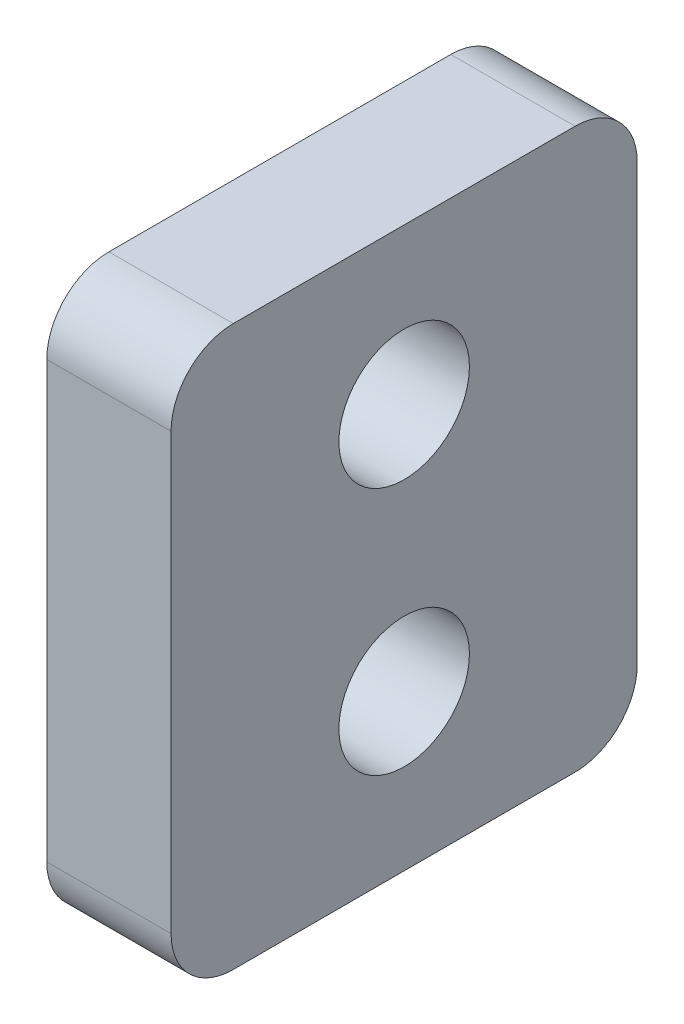
ISO-10303-21;
HEADER;
FILE_DESCRIPTION(('STEP AP214'),'2;1');
FILE_NAME('part.step','',(''),(''),'','','');
FILE_SCHEMA(('AUTOMOTIVE_DESIGN { 1 0 10303 214 1 1 1 1 }'));
ENDSEC;
DATA;
#1=APPLICATION_CONTEXT('core data for automotive mechanical design processes');
#2=APPLICATION_PROTOCOL_DEFINITION('international standard','automotive_design',2000,#1);
#3=PRODUCT_CONTEXT('',#1,'mechanical');
#4=PRODUCT('Part','Part','',(#3));
#5=PRODUCT_RELATED_PRODUCT_CATEGORY('part','',(#4));
#6=PRODUCT_DEFINITION_FORMATION('','',#4);
#7=PRODUCT_DEFINITION_CONTEXT('part definition',#1,'design');
#8=PRODUCT_DEFINITION('design','',#6,#7);
#9=PRODUCT_DEFINITION_SHAPE('','',#8);
#10=(LENGTH_UNIT() NAMED_UNIT(*) SI_UNIT(.MILLI.,.METRE.));
#11=(NAMED_UNIT(*) PLANE_ANGLE_UNIT() SI_UNIT($,.RADIAN.));
#12=(NAMED_UNIT(*) SI_UNIT($,.STERADIAN.) SOLID_ANGLE_UNIT());
#13=UNCERTAINTY_MEASURE_WITH_UNIT(LENGTH_MEASURE(1.E-05),#10,'distance_accuracy_value','');
#14=(GEOMETRIC_REPRESENTATION_CONTEXT(3) GLOBAL_UNCERTAINTY_ASSIGNED_CONTEXT((#13)) GLOBAL_UNIT_ASSIGNED_CONTEXT((#10,
#11,#12)) REPRESENTATION_CONTEXT('',''));
#15=CARTESIAN_POINT('',(0.,0.,0.));
#16=DIRECTION('',(0.,0.,1.));
#17=DIRECTION('',(1.,0.,0.));
#18=AXIS2_PLACEMENT_3D('',#15,#16,#17);
#19=CARTESIAN_POINT('',(4.,0.,0.));
#20=DIRECTION('',(-1.,0.,0.));
#21=DIRECTION('',(0.,0.,1.));
#22=AXIS2_PLACEMENT_3D('',#19,#20,#21);
#23=PLANE('',#22);
#24=DIRECTION('',(0.,0.,-1.));
#25=VECTOR('',#24,1.);
#26=CARTESIAN_POINT('',(4.,-9.,7.5));
#27=LINE('',#26,#25);
#28=CARTESIAN_POINT('',(4.,-9.,5.5));
#29=VERTEX_POINT('',#28);
#30=CARTESIAN_POINT('',(4.,-9.,-5.5));
#31=VERTEX_POINT('',#30);
#32=EDGE_CURVE('E137',#29,#31,#27,.T.);
#33=ORIENTED_EDGE('',*,*,#32,.T.);
#34=CARTESIAN_POINT('',(4.,-7.,-5.5));
#35=DIRECTION('',(-1.,0.,0.));
#36=DIRECTION('',(0.,0.,1.));
#37=AXIS2_PLACEMENT_3D('',#34,#35,#36);
#38=CIRCLE('',#37,2.);
#39=CARTESIAN_POINT('',(4.,-7.,-7.5));
#40=VERTEX_POINT('',#39);
#41=EDGE_CURVE('E155',#31,#40,#38,.F.);
#42=ORIENTED_EDGE('',*,*,#41,.T.);
#43=DIRECTION('',(0.,1.,0.));
#44=VECTOR('',#43,1.);
#45=CARTESIAN_POINT('',(4.,-9.,-7.5));
#46=LINE('',#45,#44);
#47=CARTESIAN_POINT('',(4.,7.,-7.5));
#48=VERTEX_POINT('',#47);
#49=EDGE_CURVE('E119',#40,#48,#46,.T.);
#50=ORIENTED_EDGE('',*,*,#49,.T.);
#51=CARTESIAN_POINT('',(4.,7.,-5.5));
#52=DIRECTION('',(-1.,0.,0.));
#53=DIRECTION('',(0.,0.,1.));
#54=AXIS2_PLACEMENT_3D('',#51,#52,#53);
#55=CIRCLE('',#54,2.);
#56=CARTESIAN_POINT('',(4.,9.,-5.5));
#57=VERTEX_POINT('',#56);
#58=EDGE_CURVE('E151',#48,#57,#55,.F.);
#59=ORIENTED_EDGE('',*,*,#58,.T.);
#60=DIRECTION('',(0.,0.,1.));
#61=VECTOR('',#60,1.);
#62=CARTESIAN_POINT('',(4.,9.,7.5));
#63=LINE('',#62,#61);
#64=CARTESIAN_POINT('',(4.,9.,5.5));
#65=VERTEX_POINT('',#64);
#66=EDGE_CURVE('E164',#57,#65,#63,.T.);
#67=ORIENTED_EDGE('',*,*,#66,.T.);
#68=CARTESIAN_POINT('',(4.,7.,5.5));
#69=DIRECTION('',(-1.,0.,0.));
#70=DIRECTION('',(0.,0.,1.));
#71=AXIS2_PLACEMENT_3D('',#68,#69,#70);
#72=CIRCLE('',#71,2.);
#73=CARTESIAN_POINT('',(4.,7.,7.5));
#74=VERTEX_POINT('',#73);
#75=EDGE_CURVE('E54',#65,#74,#72,.F.);
#76=ORIENTED_EDGE('',*,*,#75,.T.);
#77=DIRECTION('',(0.,-1.,0.));
#78=VECTOR('',#77,1.);
#79=CARTESIAN_POINT('',(4.,-9.,7.5));
#80=LINE('',#79,#78);
#81=CARTESIAN_POINT('',(4.,-7.,7.5));
#82=VERTEX_POINT('',#81);
#83=EDGE_CURVE('E170',#74,#82,#80,.T.);
#84=ORIENTED_EDGE('',*,*,#83,.T.);
#85=CARTESIAN_POINT('',(4.,-7.,5.5));
#86=DIRECTION('',(-1.,0.,0.));
#87=DIRECTION('',(0.,0.,1.));
#88=AXIS2_PLACEMENT_3D('',#85,#86,#87);
#89=CIRCLE('',#88,2.);
#90=EDGE_CURVE('E153',#82,#29,#89,.F.);
#91=ORIENTED_EDGE('',*,*,#90,.T.);
#92=EDGE_LOOP('',(#33,#42,#50,#59,#67,#76,#84,#91));
#93=FACE_BOUND('',#92,.T.);
#94=CARTESIAN_POINT('',(4.,4.,0.));
#95=DIRECTION('',(1.,0.,0.));
#96=DIRECTION('',(0.,0.,-1.));
#97=AXIS2_PLACEMENT_3D('',#94,#95,#96);
#98=CIRCLE('',#97,2.1);
#99=CARTESIAN_POINT('',(4.,4.,-2.1));
#100=VERTEX_POINT('',#99);
#101=EDGE_CURVE('E128',#100,#100,#98,.T.);
#102=ORIENTED_EDGE('',*,*,#101,.F.);
#103=EDGE_LOOP('',(#102));
#104=FACE_BOUND('',#103,.T.);
#105=CARTESIAN_POINT('',(4.,-4.,0.));
#106=DIRECTION('',(1.,0.,0.));
#107=DIRECTION('',(0.,0.,-1.));
#108=AXIS2_PLACEMENT_3D('',#105,#106,#107);
#109=CIRCLE('',#108,2.1);
#110=CARTESIAN_POINT('',(4.,-4.,-2.1));
#111=VERTEX_POINT('',#110);
#112=EDGE_CURVE('E185',#111,#111,#109,.T.);
#113=ORIENTED_EDGE('',*,*,#112,.F.);
#114=EDGE_LOOP('',(#113));
#115=FACE_BOUND('',#114,.T.);
#116=ADVANCED_FACE('F32',(#93,#104,#115),#23,.F.);
#117=CARTESIAN_POINT('',(0.,0.,0.));
#118=DIRECTION('',(-1.,0.,0.));
#119=DIRECTION('',(0.,0.,1.));
#120=AXIS2_PLACEMENT_3D('',#117,#118,#119);
#121=PLANE('',#120);
#122=CARTESIAN_POINT('',(0.,4.,0.));
#123=DIRECTION('',(1.,0.,0.));
#124=DIRECTION('',(0.,0.,-1.));
#125=AXIS2_PLACEMENT_3D('',#122,#123,#124);
#126=CIRCLE('',#125,2.1);
#127=CARTESIAN_POINT('',(0.,4.,-2.1));
#128=VERTEX_POINT('',#127);
#129=EDGE_CURVE('E134',#128,#128,#126,.T.);
#130=ORIENTED_EDGE('',*,*,#129,.T.);
#131=EDGE_LOOP('',(#130));
#132=FACE_BOUND('',#131,.T.);
#133=DIRECTION('',(0.,1.,0.));
#134=VECTOR('',#133,1.);
#135=CARTESIAN_POINT('',(0.,-9.,-7.5));
#136=LINE('',#135,#134);
#137=CARTESIAN_POINT('',(0.,-7.,-7.5));
#138=VERTEX_POINT('',#137);
#139=CARTESIAN_POINT('',(0.,7.,-7.5));
#140=VERTEX_POINT('',#139);
#141=EDGE_CURVE('E116',#138,#140,#136,.T.);
#142=ORIENTED_EDGE('',*,*,#141,.F.);
#143=CARTESIAN_POINT('',(0.,-7.,-5.5));
#144=DIRECTION('',(-1.,0.,0.));
#145=DIRECTION('',(0.,0.,1.));
#146=AXIS2_PLACEMENT_3D('',#143,#144,#145);
#147=CIRCLE('',#146,2.);
#148=CARTESIAN_POINT('',(0.,-9.,-5.5));
#149=VERTEX_POINT('',#148);
#150=EDGE_CURVE('E99',#138,#149,#147,.T.);
#151=ORIENTED_EDGE('',*,*,#150,.T.);
#152=DIRECTION('',(0.,0.,-1.));
#153=VECTOR('',#152,1.);
#154=CARTESIAN_POINT('',(0.,-9.,7.5));
#155=LINE('',#154,#153);
#156=CARTESIAN_POINT('',(0.,-9.,5.5));
#157=VERTEX_POINT('',#156);
#158=EDGE_CURVE('E141',#157,#149,#155,.T.);
#159=ORIENTED_EDGE('',*,*,#158,.F.);
#160=CARTESIAN_POINT('',(0.,-7.,5.5));
#161=DIRECTION('',(-1.,0.,0.));
#162=DIRECTION('',(0.,0.,1.));
#163=AXIS2_PLACEMENT_3D('',#160,#161,#162);
#164=CIRCLE('',#163,2.);
#165=CARTESIAN_POINT('',(0.,-7.,7.5));
#166=VERTEX_POINT('',#165);
#167=EDGE_CURVE('E110',#157,#166,#164,.T.);
#168=ORIENTED_EDGE('',*,*,#167,.T.);
#169=DIRECTION('',(0.,-1.,0.));
#170=VECTOR('',#169,1.);
#171=CARTESIAN_POINT('',(0.,-9.,7.5));
#172=LINE('',#171,#170);
#173=CARTESIAN_POINT('',(0.,7.,7.5));
#174=VERTEX_POINT('',#173);
#175=EDGE_CURVE('E131',#174,#166,#172,.T.);
#176=ORIENTED_EDGE('',*,*,#175,.F.);
#177=CARTESIAN_POINT('',(0.,7.,5.5));
#178=DIRECTION('',(-1.,0.,0.));
#179=DIRECTION('',(0.,0.,1.));
#180=AXIS2_PLACEMENT_3D('',#177,#178,#179);
#181=CIRCLE('',#180,2.);
#182=CARTESIAN_POINT('',(0.,9.,5.5));
#183=VERTEX_POINT('',#182);
#184=EDGE_CURVE('E120',#174,#183,#181,.T.);
#185=ORIENTED_EDGE('',*,*,#184,.T.);
#186=DIRECTION('',(0.,0.,1.));
#187=VECTOR('',#186,1.);
#188=CARTESIAN_POINT('',(0.,9.,7.5));
#189=LINE('',#188,#187);
#190=CARTESIAN_POINT('',(0.,9.,-5.5));
#191=VERTEX_POINT('',#190);
#192=EDGE_CURVE('E127',#191,#183,#189,.T.);
#193=ORIENTED_EDGE('',*,*,#192,.F.);
#194=CARTESIAN_POINT('',(0.,7.,-5.5));
#195=DIRECTION('',(-1.,0.,0.));
#196=DIRECTION('',(0.,0.,1.));
#197=AXIS2_PLACEMENT_3D('',#194,#195,#196);
#198=CIRCLE('',#197,2.);
#199=EDGE_CURVE('E126',#191,#140,#198,.T.);
#200=ORIENTED_EDGE('',*,*,#199,.T.);
#201=EDGE_LOOP('',(#142,#151,#159,#168,#176,#185,#193,#200));
#202=FACE_BOUND('',#201,.T.);
#203=CARTESIAN_POINT('',(0.,-4.,0.));
#204=DIRECTION('',(1.,0.,0.));
#205=DIRECTION('',(0.,0.,-1.));
#206=AXIS2_PLACEMENT_3D('',#203,#204,#205);
#207=CIRCLE('',#206,2.1);
#208=CARTESIAN_POINT('',(0.,-4.,-2.1));
#209=VERTEX_POINT('',#208);
#210=EDGE_CURVE('E187',#209,#209,#207,.T.);
#211=ORIENTED_EDGE('',*,*,#210,.T.);
#212=EDGE_LOOP('',(#211));
#213=FACE_BOUND('',#212,.T.);
#214=ADVANCED_FACE('F123',(#132,#202,#213),#121,.T.);
#215=CARTESIAN_POINT('',(4.,-9.,-7.5));
#216=DIRECTION('',(0.,0.,1.));
#217=DIRECTION('',(1.,0.,0.));
#218=AXIS2_PLACEMENT_3D('',#215,#216,#217);
#219=PLANE('',#218);
#220=ORIENTED_EDGE('',*,*,#49,.F.);
#221=DIRECTION('',(-1.,0.,0.));
#222=VECTOR('',#221,1.);
#223=CARTESIAN_POINT('',(4.,-7.,-7.5));
#224=LINE('',#223,#222);
#225=EDGE_CURVE('E103',#40,#138,#224,.T.);
#226=ORIENTED_EDGE('',*,*,#225,.T.);
#227=ORIENTED_EDGE('',*,*,#141,.T.);
#228=DIRECTION('',(-1.,0.,0.));
#229=VECTOR('',#228,1.);
#230=CARTESIAN_POINT('',(4.,7.,-7.5));
#231=LINE('',#230,#229);
#232=EDGE_CURVE('E121',#140,#48,#231,.F.);
#233=ORIENTED_EDGE('',*,*,#232,.T.);
#234=EDGE_LOOP('',(#220,#226,#227,#233));
#235=FACE_BOUND('',#234,.T.);
#236=ADVANCED_FACE('F115',(#235),#219,.F.);
#237=CARTESIAN_POINT('',(4.,9.,7.5));
#238=DIRECTION('',(0.,-1.,0.));
#239=DIRECTION('',(0.,0.,-1.));
#240=AXIS2_PLACEMENT_3D('',#237,#238,#239);
#241=PLANE('',#240);
#242=ORIENTED_EDGE('',*,*,#66,.F.);
#243=DIRECTION('',(-1.,0.,0.));
#244=VECTOR('',#243,1.);
#245=CARTESIAN_POINT('',(4.,9.,-5.5));
#246=LINE('',#245,#244);
#247=EDGE_CURVE('E11',#57,#191,#246,.T.);
#248=ORIENTED_EDGE('',*,*,#247,.T.);
#249=ORIENTED_EDGE('',*,*,#192,.T.);
#250=DIRECTION('',(-1.,0.,0.));
#251=VECTOR('',#250,1.);
#252=CARTESIAN_POINT('',(4.,9.,5.5));
#253=LINE('',#252,#251);
#254=EDGE_CURVE('E40',#183,#65,#253,.F.);
#255=ORIENTED_EDGE('',*,*,#254,.T.);
#256=EDGE_LOOP('',(#242,#248,#249,#255));
#257=FACE_BOUND('',#256,.T.);
#258=ADVANCED_FACE('F163',(#257),#241,.F.);
#259=CARTESIAN_POINT('',(4.,-9.,7.5));
#260=DIRECTION('',(0.,0.,-1.));
#261=DIRECTION('',(-1.,0.,0.));
#262=AXIS2_PLACEMENT_3D('',#259,#260,#261);
#263=PLANE('',#262);
#264=ORIENTED_EDGE('',*,*,#175,.T.);
#265=DIRECTION('',(-1.,0.,0.));
#266=VECTOR('',#265,1.);
#267=CARTESIAN_POINT('',(4.,-7.,7.5));
#268=LINE('',#267,#266);
#269=EDGE_CURVE('E47',#166,#82,#268,.F.);
#270=ORIENTED_EDGE('',*,*,#269,.T.);
#271=ORIENTED_EDGE('',*,*,#83,.F.);
#272=DIRECTION('',(-1.,0.,0.));
#273=VECTOR('',#272,1.);
#274=CARTESIAN_POINT('',(4.,7.,7.5));
#275=LINE('',#274,#273);
#276=EDGE_CURVE('E157',#74,#174,#275,.T.);
#277=ORIENTED_EDGE('',*,*,#276,.T.);
#278=EDGE_LOOP('',(#264,#270,#271,#277));
#279=FACE_BOUND('',#278,.T.);
#280=ADVANCED_FACE('F174',(#279),#263,.F.);
#281=CARTESIAN_POINT('',(4.,-9.,7.5));
#282=DIRECTION('',(0.,1.,0.));
#283=DIRECTION('',(0.,0.,1.));
#284=AXIS2_PLACEMENT_3D('',#281,#282,#283);
#285=PLANE('',#284);
#286=ORIENTED_EDGE('',*,*,#158,.T.);
#287=DIRECTION('',(-1.,0.,0.));
#288=VECTOR('',#287,1.);
#289=CARTESIAN_POINT('',(4.,-9.,-5.5));
#290=LINE('',#289,#288);
#291=EDGE_CURVE('E104',#149,#31,#290,.F.);
#292=ORIENTED_EDGE('',*,*,#291,.T.);
#293=ORIENTED_EDGE('',*,*,#32,.F.);
#294=DIRECTION('',(-1.,0.,0.));
#295=VECTOR('',#294,1.);
#296=CARTESIAN_POINT('',(4.,-9.,5.5));
#297=LINE('',#296,#295);
#298=EDGE_CURVE('E109',#29,#157,#297,.T.);
#299=ORIENTED_EDGE('',*,*,#298,.T.);
#300=EDGE_LOOP('',(#286,#292,#293,#299));
#301=FACE_BOUND('',#300,.T.);
#302=ADVANCED_FACE('F181',(#301),#285,.F.);
#303=CARTESIAN_POINT('',(4.,4.,0.));
#304=DIRECTION('',(-1.,0.,0.));
#305=DIRECTION('',(0.,0.,1.));
#306=AXIS2_PLACEMENT_3D('',#303,#304,#305);
#307=CYLINDRICAL_SURFACE('',#306,2.1);
#308=ORIENTED_EDGE('',*,*,#101,.T.);
#309=EDGE_LOOP('',(#308));
#310=FACE_BOUND('',#309,.T.);
#311=ORIENTED_EDGE('',*,*,#129,.F.);
#312=EDGE_LOOP('',(#311));
#313=FACE_BOUND('',#312,.T.);
#314=ADVANCED_FACE('F204',(#310,#313),#307,.F.);
#315=CARTESIAN_POINT('',(4.,-4.,0.));
#316=DIRECTION('',(-1.,0.,0.));
#317=DIRECTION('',(0.,0.,1.));
#318=AXIS2_PLACEMENT_3D('',#315,#316,#317);
#319=CYLINDRICAL_SURFACE('',#318,2.1);
#320=ORIENTED_EDGE('',*,*,#112,.T.);
#321=EDGE_LOOP('',(#320));
#322=FACE_BOUND('',#321,.T.);
#323=ORIENTED_EDGE('',*,*,#210,.F.);
#324=EDGE_LOOP('',(#323));
#325=FACE_BOUND('',#324,.T.);
#326=ADVANCED_FACE('F193',(#322,#325),#319,.F.);
#327=CARTESIAN_POINT('',(4.,-7.,-5.5));
#328=DIRECTION('',(-1.,0.,0.));
#329=DIRECTION('',(0.,0.,1.));
#330=AXIS2_PLACEMENT_3D('',#327,#328,#329);
#331=CYLINDRICAL_SURFACE('',#330,2.);
#332=ORIENTED_EDGE('',*,*,#41,.F.);
#333=ORIENTED_EDGE('',*,*,#291,.F.);
#334=ORIENTED_EDGE('',*,*,#150,.F.);
#335=ORIENTED_EDGE('',*,*,#225,.F.);
#336=EDGE_LOOP('',(#332,#333,#334,#335));
#337=FACE_BOUND('',#336,.T.);
#338=ADVANCED_FACE('F102',(#337),#331,.T.);
#339=CARTESIAN_POINT('',(4.,-7.,5.5));
#340=DIRECTION('',(-1.,0.,0.));
#341=DIRECTION('',(0.,0.,1.));
#342=AXIS2_PLACEMENT_3D('',#339,#340,#341);
#343=CYLINDRICAL_SURFACE('',#342,2.);
#344=ORIENTED_EDGE('',*,*,#90,.F.);
#345=ORIENTED_EDGE('',*,*,#269,.F.);
#346=ORIENTED_EDGE('',*,*,#167,.F.);
#347=ORIENTED_EDGE('',*,*,#298,.F.);
#348=EDGE_LOOP('',(#344,#345,#346,#347));
#349=FACE_BOUND('',#348,.T.);
#350=ADVANCED_FACE('F178',(#349),#343,.T.);
#351=CARTESIAN_POINT('',(4.,7.,-5.5));
#352=DIRECTION('',(-1.,0.,0.));
#353=DIRECTION('',(0.,0.,1.));
#354=AXIS2_PLACEMENT_3D('',#351,#352,#353);
#355=CYLINDRICAL_SURFACE('',#354,2.);
#356=ORIENTED_EDGE('',*,*,#58,.F.);
#357=ORIENTED_EDGE('',*,*,#232,.F.);
#358=ORIENTED_EDGE('',*,*,#199,.F.);
#359=ORIENTED_EDGE('',*,*,#247,.F.);
#360=EDGE_LOOP('',(#356,#357,#358,#359));
#361=FACE_BOUND('',#360,.T.);
#362=ADVANCED_FACE('F218',(#361),#355,.T.);
#363=CARTESIAN_POINT('',(4.,7.,5.5));
#364=DIRECTION('',(-1.,0.,0.));
#365=DIRECTION('',(0.,0.,1.));
#366=AXIS2_PLACEMENT_3D('',#363,#364,#365);
#367=CYLINDRICAL_SURFACE('',#366,2.);
#368=ORIENTED_EDGE('',*,*,#75,.F.);
#369=ORIENTED_EDGE('',*,*,#254,.F.);
#370=ORIENTED_EDGE('',*,*,#184,.F.);
#371=ORIENTED_EDGE('',*,*,#276,.F.);
#372=EDGE_LOOP('',(#368,#369,#370,#371));
#373=FACE_BOUND('',#372,.T.);
#374=ADVANCED_FACE('F34',(#373),#367,.T.);
#375=CLOSED_SHELL('',(#116,#214,#236,#258,#280,#302,#314,#326,#338,#350,#362,#374));
#376=MANIFOLD_SOLID_BREP('B2',#375);
#377=ADVANCED_BREP_SHAPE_REPRESENTATION('',(#18,#376),#14);
#378=SHAPE_DEFINITION_REPRESENTATION(#9,#377);
ENDSEC;
END-ISO-10303-21;
